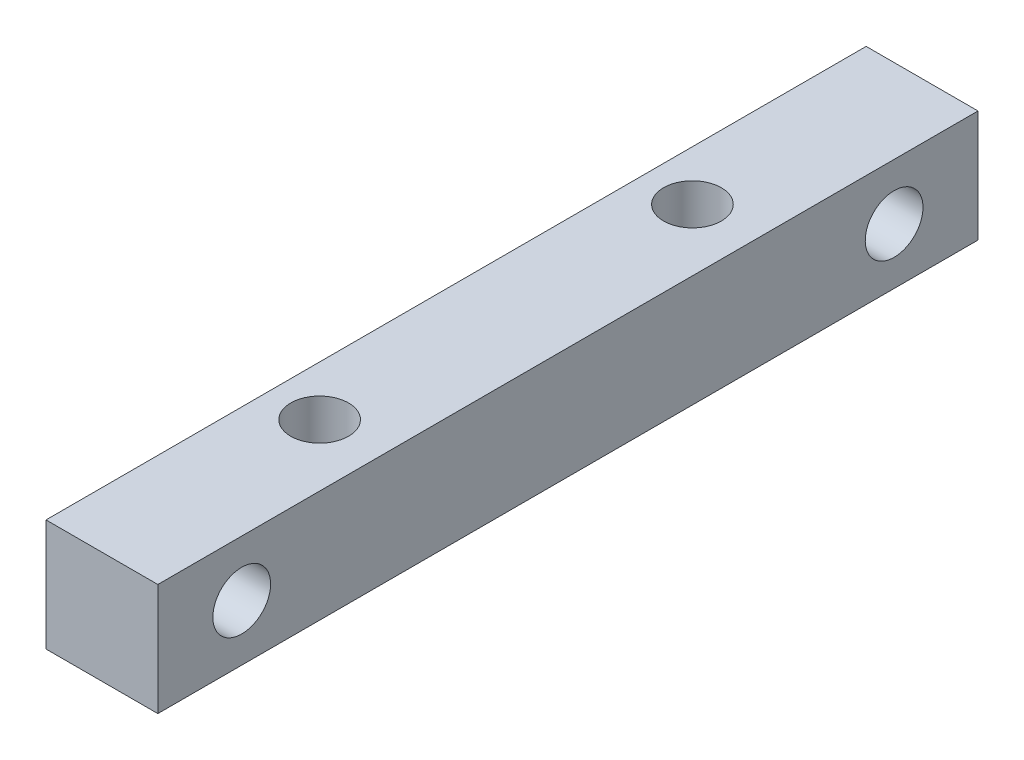
ISO-10303-21;
HEADER;
FILE_DESCRIPTION(('STEP AP214'),'2;1');
FILE_NAME('part.step','',(''),(''),'','','');
FILE_SCHEMA(('AUTOMOTIVE_DESIGN { 1 0 10303 214 1 1 1 1 }'));
ENDSEC;
DATA;
#1=APPLICATION_CONTEXT('core data for automotive mechanical design processes');
#2=APPLICATION_PROTOCOL_DEFINITION('international standard','automotive_design',2000,#1);
#3=PRODUCT_CONTEXT('',#1,'mechanical');
#4=PRODUCT('Part','Part','',(#3));
#5=PRODUCT_RELATED_PRODUCT_CATEGORY('part','',(#4));
#6=PRODUCT_DEFINITION_FORMATION('','',#4);
#7=PRODUCT_DEFINITION_CONTEXT('part definition',#1,'design');
#8=PRODUCT_DEFINITION('design','',#6,#7);
#9=PRODUCT_DEFINITION_SHAPE('','',#8);
#10=(LENGTH_UNIT() NAMED_UNIT(*) SI_UNIT(.MILLI.,.METRE.));
#11=(NAMED_UNIT(*) PLANE_ANGLE_UNIT() SI_UNIT($,.RADIAN.));
#12=(NAMED_UNIT(*) SI_UNIT($,.STERADIAN.) SOLID_ANGLE_UNIT());
#13=UNCERTAINTY_MEASURE_WITH_UNIT(LENGTH_MEASURE(1.E-05),#10,'distance_accuracy_value','');
#14=(GEOMETRIC_REPRESENTATION_CONTEXT(3) GLOBAL_UNCERTAINTY_ASSIGNED_CONTEXT((#13)) GLOBAL_UNIT_ASSIGNED_CONTEXT((#10,
#11,#12)) REPRESENTATION_CONTEXT('',''));
#15=CARTESIAN_POINT('',(0.,0.,0.));
#16=DIRECTION('',(0.,0.,1.));
#17=DIRECTION('',(1.,0.,0.));
#18=AXIS2_PLACEMENT_3D('',#15,#16,#17);
#19=CARTESIAN_POINT('',(3.,3.,22.));
#20=DIRECTION('',(-1.,0.,0.));
#21=DIRECTION('',(0.,-1.,0.));
#22=AXIS2_PLACEMENT_3D('',#19,#20,#21);
#23=PLANE('',#22);
#24=CARTESIAN_POINT('',(3.,0.,17.5));
#25=DIRECTION('',(1.,0.,0.));
#26=DIRECTION('',(0.,1.,0.));
#27=AXIS2_PLACEMENT_3D('',#24,#25,#26);
#28=CIRCLE('',#27,1.55);
#29=CARTESIAN_POINT('',(3.,1.55,17.5));
#30=VERTEX_POINT('',#29);
#31=EDGE_CURVE('E114',#30,#30,#28,.T.);
#32=ORIENTED_EDGE('',*,*,#31,.F.);
#33=EDGE_LOOP('',(#32));
#34=FACE_BOUND('',#33,.T.);
#35=CARTESIAN_POINT('',(3.,0.,-17.5));
#36=DIRECTION('',(1.,0.,0.));
#37=DIRECTION('',(0.,1.,0.));
#38=AXIS2_PLACEMENT_3D('',#35,#36,#37);
#39=CIRCLE('',#38,1.55);
#40=CARTESIAN_POINT('',(3.,1.55000000000001,-17.5));
#41=VERTEX_POINT('',#40);
#42=EDGE_CURVE('E122',#41,#41,#39,.T.);
#43=ORIENTED_EDGE('',*,*,#42,.F.);
#44=EDGE_LOOP('',(#43));
#45=FACE_BOUND('',#44,.T.);
#46=DIRECTION('',(0.,1.,0.));
#47=VECTOR('',#46,1.);
#48=CARTESIAN_POINT('',(3.,3.,-22.));
#49=LINE('',#48,#47);
#50=CARTESIAN_POINT('',(3.,-3.,-22.));
#51=VERTEX_POINT('',#50);
#52=CARTESIAN_POINT('',(3.,3.,-22.));
#53=VERTEX_POINT('',#52);
#54=EDGE_CURVE('E102',#51,#53,#49,.T.);
#55=ORIENTED_EDGE('',*,*,#54,.T.);
#56=DIRECTION('',(0.,0.,-1.));
#57=VECTOR('',#56,1.);
#58=CARTESIAN_POINT('',(3.,3.,22.));
#59=LINE('',#58,#57);
#60=CARTESIAN_POINT('',(3.,3.,22.));
#61=VERTEX_POINT('',#60);
#62=EDGE_CURVE('E11',#61,#53,#59,.T.);
#63=ORIENTED_EDGE('',*,*,#62,.F.);
#64=DIRECTION('',(0.,1.,0.));
#65=VECTOR('',#64,1.);
#66=CARTESIAN_POINT('',(3.,3.,22.));
#67=LINE('',#66,#65);
#68=CARTESIAN_POINT('',(3.,-3.,22.));
#69=VERTEX_POINT('',#68);
#70=EDGE_CURVE('E89',#69,#61,#67,.T.);
#71=ORIENTED_EDGE('',*,*,#70,.F.);
#72=DIRECTION('',(0.,0.,-1.));
#73=VECTOR('',#72,1.);
#74=CARTESIAN_POINT('',(3.,-3.,22.));
#75=LINE('',#74,#73);
#76=EDGE_CURVE('E98',#69,#51,#75,.T.);
#77=ORIENTED_EDGE('',*,*,#76,.T.);
#78=EDGE_LOOP('',(#55,#63,#71,#77));
#79=FACE_BOUND('',#78,.T.);
#80=ADVANCED_FACE('F36',(#34,#45,#79),#23,.F.);
#81=CARTESIAN_POINT('',(-3.,3.,22.));
#82=DIRECTION('',(0.,-1.,0.));
#83=DIRECTION('',(0.,0.,-1.));
#84=AXIS2_PLACEMENT_3D('',#81,#82,#83);
#85=PLANE('',#84);
#86=CARTESIAN_POINT('',(-0.320508075671532,3.,10.0000000000001));
#87=DIRECTION('',(0.,1.,0.));
#88=DIRECTION('',(0.,0.,1.));
#89=AXIS2_PLACEMENT_3D('',#86,#87,#88);
#90=CIRCLE('',#89,1.55);
#91=CARTESIAN_POINT('',(-0.320508075671532,3.,11.5500000000001));
#92=VERTEX_POINT('',#91);
#93=EDGE_CURVE('E118',#92,#92,#90,.T.);
#94=ORIENTED_EDGE('',*,*,#93,.F.);
#95=EDGE_LOOP('',(#94));
#96=FACE_BOUND('',#95,.T.);
#97=CARTESIAN_POINT('',(-0.320508075671532,3.,-10.0000000000001));
#98=DIRECTION('',(0.,1.,0.));
#99=DIRECTION('',(0.,0.,1.));
#100=AXIS2_PLACEMENT_3D('',#97,#98,#99);
#101=CIRCLE('',#100,1.55);
#102=CARTESIAN_POINT('',(-0.320508075671532,3.,-8.45000000000007));
#103=VERTEX_POINT('',#102);
#104=EDGE_CURVE('E124',#103,#103,#101,.T.);
#105=ORIENTED_EDGE('',*,*,#104,.F.);
#106=EDGE_LOOP('',(#105));
#107=FACE_BOUND('',#106,.T.);
#108=DIRECTION('',(-1.,0.,0.));
#109=VECTOR('',#108,1.);
#110=CARTESIAN_POINT('',(-3.,3.,-22.));
#111=LINE('',#110,#109);
#112=CARTESIAN_POINT('',(-3.,3.,-22.));
#113=VERTEX_POINT('',#112);
#114=EDGE_CURVE('E93',#53,#113,#111,.T.);
#115=ORIENTED_EDGE('',*,*,#114,.T.);
#116=DIRECTION('',(0.,0.,-1.));
#117=VECTOR('',#116,1.);
#118=CARTESIAN_POINT('',(-3.,3.,22.));
#119=LINE('',#118,#117);
#120=CARTESIAN_POINT('',(-3.,3.,22.));
#121=VERTEX_POINT('',#120);
#122=EDGE_CURVE('E45',#121,#113,#119,.T.);
#123=ORIENTED_EDGE('',*,*,#122,.F.);
#124=DIRECTION('',(-1.,0.,0.));
#125=VECTOR('',#124,1.);
#126=CARTESIAN_POINT('',(-3.,3.,22.));
#127=LINE('',#126,#125);
#128=EDGE_CURVE('E84',#61,#121,#127,.T.);
#129=ORIENTED_EDGE('',*,*,#128,.F.);
#130=ORIENTED_EDGE('',*,*,#62,.T.);
#131=EDGE_LOOP('',(#115,#123,#129,#130));
#132=FACE_BOUND('',#131,.T.);
#133=ADVANCED_FACE('F92',(#96,#107,#132),#85,.F.);
#134=CARTESIAN_POINT('',(-3.,3.,22.));
#135=DIRECTION('',(1.,0.,0.));
#136=DIRECTION('',(0.,1.,0.));
#137=AXIS2_PLACEMENT_3D('',#134,#135,#136);
#138=PLANE('',#137);
#139=CARTESIAN_POINT('',(-3.,0.,17.5));
#140=DIRECTION('',(1.,0.,0.));
#141=DIRECTION('',(0.,1.,0.));
#142=AXIS2_PLACEMENT_3D('',#139,#140,#141);
#143=CIRCLE('',#142,1.55);
#144=CARTESIAN_POINT('',(-3.,1.55,17.5));
#145=VERTEX_POINT('',#144);
#146=EDGE_CURVE('E105',#145,#145,#143,.T.);
#147=ORIENTED_EDGE('',*,*,#146,.T.);
#148=EDGE_LOOP('',(#147));
#149=FACE_BOUND('',#148,.T.);
#150=CARTESIAN_POINT('',(-3.,0.,-17.5));
#151=DIRECTION('',(1.,0.,0.));
#152=DIRECTION('',(0.,1.,0.));
#153=AXIS2_PLACEMENT_3D('',#150,#151,#152);
#154=CIRCLE('',#153,1.55);
#155=CARTESIAN_POINT('',(-3.,1.55000000000001,-17.5));
#156=VERTEX_POINT('',#155);
#157=EDGE_CURVE('E111',#156,#156,#154,.T.);
#158=ORIENTED_EDGE('',*,*,#157,.T.);
#159=EDGE_LOOP('',(#158));
#160=FACE_BOUND('',#159,.T.);
#161=DIRECTION('',(0.,-1.,0.));
#162=VECTOR('',#161,1.);
#163=CARTESIAN_POINT('',(-3.,3.,-22.));
#164=LINE('',#163,#162);
#165=CARTESIAN_POINT('',(-3.,-3.,-22.));
#166=VERTEX_POINT('',#165);
#167=EDGE_CURVE('E71',#113,#166,#164,.T.);
#168=ORIENTED_EDGE('',*,*,#167,.T.);
#169=DIRECTION('',(0.,0.,-1.));
#170=VECTOR('',#169,1.);
#171=CARTESIAN_POINT('',(-3.,-3.,22.));
#172=LINE('',#171,#170);
#173=CARTESIAN_POINT('',(-3.,-3.,22.));
#174=VERTEX_POINT('',#173);
#175=EDGE_CURVE('E94',#174,#166,#172,.T.);
#176=ORIENTED_EDGE('',*,*,#175,.F.);
#177=DIRECTION('',(0.,-1.,0.));
#178=VECTOR('',#177,1.);
#179=CARTESIAN_POINT('',(-3.,3.,22.));
#180=LINE('',#179,#178);
#181=EDGE_CURVE('E87',#121,#174,#180,.T.);
#182=ORIENTED_EDGE('',*,*,#181,.F.);
#183=ORIENTED_EDGE('',*,*,#122,.T.);
#184=EDGE_LOOP('',(#168,#176,#182,#183));
#185=FACE_BOUND('',#184,.T.);
#186=ADVANCED_FACE('F96',(#149,#160,#185),#138,.F.);
#187=CARTESIAN_POINT('',(-3.,-3.,22.));
#188=DIRECTION('',(0.,1.,0.));
#189=DIRECTION('',(0.,0.,1.));
#190=AXIS2_PLACEMENT_3D('',#187,#188,#189);
#191=PLANE('',#190);
#192=CARTESIAN_POINT('',(-0.320508075671532,-3.,10.0000000000001));
#193=DIRECTION('',(0.,1.,0.));
#194=DIRECTION('',(0.,0.,1.));
#195=AXIS2_PLACEMENT_3D('',#192,#193,#194);
#196=CIRCLE('',#195,1.55);
#197=CARTESIAN_POINT('',(-0.320508075671532,-3.,11.5500000000001));
#198=VERTEX_POINT('',#197);
#199=EDGE_CURVE('E39',#198,#198,#196,.T.);
#200=ORIENTED_EDGE('',*,*,#199,.T.);
#201=EDGE_LOOP('',(#200));
#202=FACE_BOUND('',#201,.T.);
#203=CARTESIAN_POINT('',(-0.320508075671532,-3.,-10.0000000000001));
#204=DIRECTION('',(0.,1.,0.));
#205=DIRECTION('',(0.,0.,1.));
#206=AXIS2_PLACEMENT_3D('',#203,#204,#205);
#207=CIRCLE('',#206,1.55);
#208=CARTESIAN_POINT('',(-0.320508075671532,-3.,-8.45000000000007));
#209=VERTEX_POINT('',#208);
#210=EDGE_CURVE('E116',#209,#209,#207,.T.);
#211=ORIENTED_EDGE('',*,*,#210,.T.);
#212=EDGE_LOOP('',(#211));
#213=FACE_BOUND('',#212,.T.);
#214=DIRECTION('',(1.,0.,0.));
#215=VECTOR('',#214,1.);
#216=CARTESIAN_POINT('',(-3.,-3.,-22.));
#217=LINE('',#216,#215);
#218=EDGE_CURVE('E77',#166,#51,#217,.T.);
#219=ORIENTED_EDGE('',*,*,#218,.T.);
#220=ORIENTED_EDGE('',*,*,#76,.F.);
#221=DIRECTION('',(1.,0.,0.));
#222=VECTOR('',#221,1.);
#223=CARTESIAN_POINT('',(-3.,-3.,22.));
#224=LINE('',#223,#222);
#225=EDGE_CURVE('E54',#174,#69,#224,.T.);
#226=ORIENTED_EDGE('',*,*,#225,.F.);
#227=ORIENTED_EDGE('',*,*,#175,.T.);
#228=EDGE_LOOP('',(#219,#220,#226,#227));
#229=FACE_BOUND('',#228,.T.);
#230=ADVANCED_FACE('F153',(#202,#213,#229),#191,.F.);
#231=CARTESIAN_POINT('',(0.,0.,22.));
#232=DIRECTION('',(0.,0.,1.));
#233=DIRECTION('',(1.,0.,0.));
#234=AXIS2_PLACEMENT_3D('',#231,#232,#233);
#235=PLANE('',#234);
#236=ORIENTED_EDGE('',*,*,#70,.T.);
#237=ORIENTED_EDGE('',*,*,#128,.T.);
#238=ORIENTED_EDGE('',*,*,#181,.T.);
#239=ORIENTED_EDGE('',*,*,#225,.T.);
#240=EDGE_LOOP('',(#236,#237,#238,#239));
#241=FACE_BOUND('',#240,.T.);
#242=ADVANCED_FACE('F85',(#241),#235,.T.);
#243=CARTESIAN_POINT('',(0.,0.,-22.));
#244=DIRECTION('',(0.,0.,1.));
#245=DIRECTION('',(1.,0.,0.));
#246=AXIS2_PLACEMENT_3D('',#243,#244,#245);
#247=PLANE('',#246);
#248=ORIENTED_EDGE('',*,*,#54,.F.);
#249=ORIENTED_EDGE('',*,*,#218,.F.);
#250=ORIENTED_EDGE('',*,*,#167,.F.);
#251=ORIENTED_EDGE('',*,*,#114,.F.);
#252=EDGE_LOOP('',(#248,#249,#250,#251));
#253=FACE_BOUND('',#252,.T.);
#254=ADVANCED_FACE('F144',(#253),#247,.F.);
#255=CARTESIAN_POINT('',(-41.,0.,-17.5));
#256=DIRECTION('',(1.,0.,0.));
#257=DIRECTION('',(0.,1.,0.));
#258=AXIS2_PLACEMENT_3D('',#255,#256,#257);
#259=CYLINDRICAL_SURFACE('',#258,1.55);
#260=ORIENTED_EDGE('',*,*,#42,.T.);
#261=EDGE_LOOP('',(#260));
#262=FACE_BOUND('',#261,.T.);
#263=ORIENTED_EDGE('',*,*,#157,.F.);
#264=EDGE_LOOP('',(#263));
#265=FACE_BOUND('',#264,.T.);
#266=ADVANCED_FACE('F136',(#262,#265),#259,.F.);
#267=CARTESIAN_POINT('',(-41.,0.,17.5));
#268=DIRECTION('',(1.,0.,0.));
#269=DIRECTION('',(0.,1.,0.));
#270=AXIS2_PLACEMENT_3D('',#267,#268,#269);
#271=CYLINDRICAL_SURFACE('',#270,1.55);
#272=ORIENTED_EDGE('',*,*,#31,.T.);
#273=EDGE_LOOP('',(#272));
#274=FACE_BOUND('',#273,.T.);
#275=ORIENTED_EDGE('',*,*,#146,.F.);
#276=EDGE_LOOP('',(#275));
#277=FACE_BOUND('',#276,.T.);
#278=ADVANCED_FACE('F151',(#274,#277),#271,.F.);
#279=CARTESIAN_POINT('',(-0.320508075671532,-7.,-10.0000000000001));
#280=DIRECTION('',(0.,1.,0.));
#281=DIRECTION('',(0.,0.,1.));
#282=AXIS2_PLACEMENT_3D('',#279,#280,#281);
#283=CYLINDRICAL_SURFACE('',#282,1.55);
#284=ORIENTED_EDGE('',*,*,#104,.T.);
#285=EDGE_LOOP('',(#284));
#286=FACE_BOUND('',#285,.T.);
#287=ORIENTED_EDGE('',*,*,#210,.F.);
#288=EDGE_LOOP('',(#287));
#289=FACE_BOUND('',#288,.T.);
#290=ADVANCED_FACE('F168',(#286,#289),#283,.F.);
#291=CARTESIAN_POINT('',(-0.320508075671532,-7.,10.0000000000001));
#292=DIRECTION('',(0.,1.,0.));
#293=DIRECTION('',(0.,0.,1.));
#294=AXIS2_PLACEMENT_3D('',#291,#292,#293);
#295=CYLINDRICAL_SURFACE('',#294,1.55);
#296=ORIENTED_EDGE('',*,*,#93,.T.);
#297=EDGE_LOOP('',(#296));
#298=FACE_BOUND('',#297,.T.);
#299=ORIENTED_EDGE('',*,*,#199,.F.);
#300=EDGE_LOOP('',(#299));
#301=FACE_BOUND('',#300,.T.);
#302=ADVANCED_FACE('F171',(#298,#301),#295,.F.);
#303=CLOSED_SHELL('',(#80,#133,#186,#230,#242,#254,#266,#278,#290,#302));
#304=MANIFOLD_SOLID_BREP('B2',#303);
#305=ADVANCED_BREP_SHAPE_REPRESENTATION('',(#18,#304),#14);
#306=SHAPE_DEFINITION_REPRESENTATION(#9,#305);
ENDSEC;
END-ISO-10303-21;
